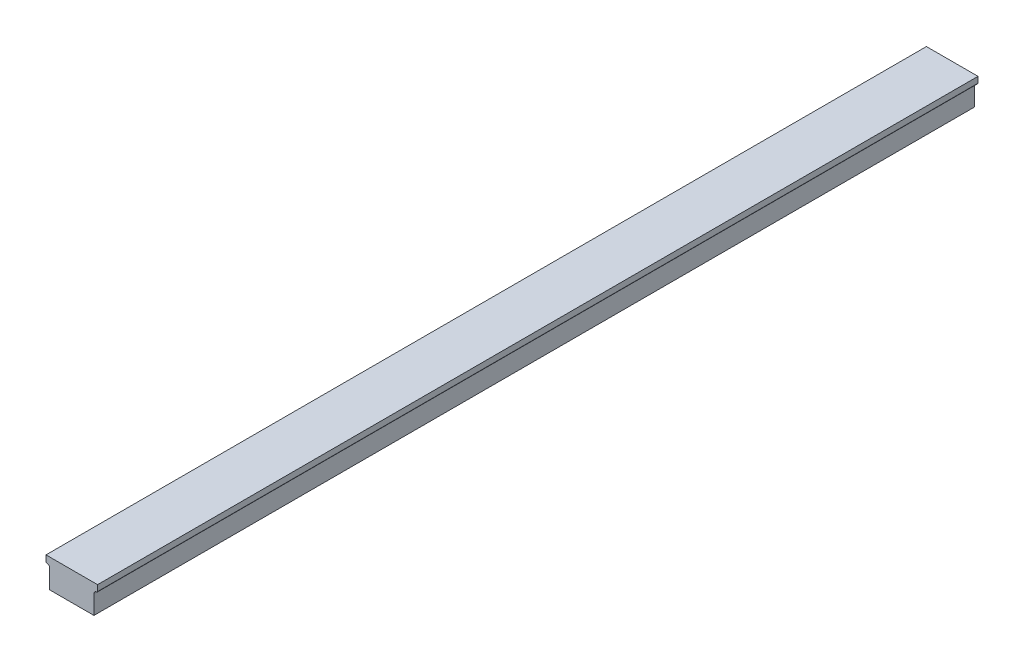
ISO-10303-21;
HEADER;
FILE_DESCRIPTION(('STEP AP214'),'2;1');
FILE_NAME('part.step','',(''),(''),'','','');
FILE_SCHEMA(('AUTOMOTIVE_DESIGN { 1 0 10303 214 1 1 1 1 }'));
ENDSEC;
DATA;
#1=APPLICATION_CONTEXT('core data for automotive mechanical design processes');
#2=APPLICATION_PROTOCOL_DEFINITION('international standard','automotive_design',2000,#1);
#3=PRODUCT_CONTEXT('',#1,'mechanical');
#4=PRODUCT('Part','Part','',(#3));
#5=PRODUCT_RELATED_PRODUCT_CATEGORY('part','',(#4));
#6=PRODUCT_DEFINITION_FORMATION('','',#4);
#7=PRODUCT_DEFINITION_CONTEXT('part definition',#1,'design');
#8=PRODUCT_DEFINITION('design','',#6,#7);
#9=PRODUCT_DEFINITION_SHAPE('','',#8);
#10=(LENGTH_UNIT() NAMED_UNIT(*) SI_UNIT(.MILLI.,.METRE.));
#11=(NAMED_UNIT(*) PLANE_ANGLE_UNIT() SI_UNIT($,.RADIAN.));
#12=(NAMED_UNIT(*) SI_UNIT($,.STERADIAN.) SOLID_ANGLE_UNIT());
#13=UNCERTAINTY_MEASURE_WITH_UNIT(LENGTH_MEASURE(1.E-05),#10,'distance_accuracy_value','');
#14=(GEOMETRIC_REPRESENTATION_CONTEXT(3) GLOBAL_UNCERTAINTY_ASSIGNED_CONTEXT((#13)) GLOBAL_UNIT_ASSIGNED_CONTEXT((#10,
#11,#12)) REPRESENTATION_CONTEXT('',''));
#15=CARTESIAN_POINT('',(0.,0.,0.));
#16=DIRECTION('',(0.,0.,1.));
#17=DIRECTION('',(1.,0.,0.));
#18=AXIS2_PLACEMENT_3D('',#15,#16,#17);
#19=CARTESIAN_POINT('',(4.9,2.4,194.633333333333));
#20=DIRECTION('',(-1.,0.,0.));
#21=DIRECTION('',(0.,0.,1.));
#22=AXIS2_PLACEMENT_3D('',#19,#20,#21);
#23=PLANE('',#22);
#24=DIRECTION('',(0.,1.,0.));
#25=VECTOR('',#24,1.);
#26=CARTESIAN_POINT('',(4.9,2.4,0.));
#27=LINE('',#26,#25);
#28=CARTESIAN_POINT('',(4.9,-2.4,0.));
#29=VERTEX_POINT('',#28);
#30=CARTESIAN_POINT('',(4.9,1.8,0.));
#31=VERTEX_POINT('',#30);
#32=EDGE_CURVE('E147',#29,#31,#27,.T.);
#33=ORIENTED_EDGE('',*,*,#32,.T.);
#34=DIRECTION('',(0.,0.,-1.));
#35=VECTOR('',#34,1.);
#36=CARTESIAN_POINT('',(4.9,1.8,194.633333333333));
#37=LINE('',#36,#35);
#38=CARTESIAN_POINT('',(4.9,1.8,194.633333333333));
#39=VERTEX_POINT('',#38);
#40=EDGE_CURVE('E167',#31,#39,#37,.F.);
#41=ORIENTED_EDGE('',*,*,#40,.T.);
#42=DIRECTION('',(0.,1.,0.));
#43=VECTOR('',#42,1.);
#44=CARTESIAN_POINT('',(4.9,2.4,194.633333333333));
#45=LINE('',#44,#43);
#46=CARTESIAN_POINT('',(4.9,-2.4,194.633333333333));
#47=VERTEX_POINT('',#46);
#48=EDGE_CURVE('E123',#47,#39,#45,.T.);
#49=ORIENTED_EDGE('',*,*,#48,.F.);
#50=DIRECTION('',(0.,0.,-1.));
#51=VECTOR('',#50,1.);
#52=CARTESIAN_POINT('',(4.9,-2.4,194.633333333333));
#53=LINE('',#52,#51);
#54=EDGE_CURVE('E146',#47,#29,#53,.T.);
#55=ORIENTED_EDGE('',*,*,#54,.T.);
#56=EDGE_LOOP('',(#33,#41,#49,#55));
#57=FACE_BOUND('',#56,.T.);
#58=ADVANCED_FACE('F39',(#57),#23,.F.);
#59=CARTESIAN_POINT('',(5.7,3.9,194.633333333333));
#60=DIRECTION('',(-1.,0.,0.));
#61=DIRECTION('',(0.,0.,1.));
#62=AXIS2_PLACEMENT_3D('',#59,#60,#61);
#63=PLANE('',#62);
#64=DIRECTION('',(0.,1.,0.));
#65=VECTOR('',#64,1.);
#66=CARTESIAN_POINT('',(5.7,3.9,194.633333333333));
#67=LINE('',#66,#65);
#68=CARTESIAN_POINT('',(5.7,2.6,194.633333333333));
#69=VERTEX_POINT('',#68);
#70=CARTESIAN_POINT('',(5.7,3.9,194.633333333333));
#71=VERTEX_POINT('',#70);
#72=EDGE_CURVE('E115',#69,#71,#67,.T.);
#73=ORIENTED_EDGE('',*,*,#72,.F.);
#74=DIRECTION('',(0.,0.,-1.));
#75=VECTOR('',#74,1.);
#76=CARTESIAN_POINT('',(5.7,2.6,194.633333333333));
#77=LINE('',#76,#75);
#78=CARTESIAN_POINT('',(5.7,2.6,0.));
#79=VERTEX_POINT('',#78);
#80=EDGE_CURVE('E11',#69,#79,#77,.T.);
#81=ORIENTED_EDGE('',*,*,#80,.T.);
#82=DIRECTION('',(0.,1.,0.));
#83=VECTOR('',#82,1.);
#84=CARTESIAN_POINT('',(5.7,3.9,0.));
#85=LINE('',#84,#83);
#86=CARTESIAN_POINT('',(5.7,3.9,0.));
#87=VERTEX_POINT('',#86);
#88=EDGE_CURVE('E129',#79,#87,#85,.T.);
#89=ORIENTED_EDGE('',*,*,#88,.T.);
#90=DIRECTION('',(0.,0.,-1.));
#91=VECTOR('',#90,1.);
#92=CARTESIAN_POINT('',(5.7,3.9,194.633333333333));
#93=LINE('',#92,#91);
#94=EDGE_CURVE('E126',#71,#87,#93,.T.);
#95=ORIENTED_EDGE('',*,*,#94,.F.);
#96=EDGE_LOOP('',(#73,#81,#89,#95));
#97=FACE_BOUND('',#96,.T.);
#98=ADVANCED_FACE('F127',(#97),#63,.F.);
#99=CARTESIAN_POINT('',(-5.7,3.9,194.633333333333));
#100=DIRECTION('',(0.,-1.,0.));
#101=DIRECTION('',(0.,0.,-1.));
#102=AXIS2_PLACEMENT_3D('',#99,#100,#101);
#103=PLANE('',#102);
#104=DIRECTION('',(-1.,0.,0.));
#105=VECTOR('',#104,1.);
#106=CARTESIAN_POINT('',(-5.7,3.9,0.));
#107=LINE('',#106,#105);
#108=CARTESIAN_POINT('',(-5.7,3.9,0.));
#109=VERTEX_POINT('',#108);
#110=EDGE_CURVE('E151',#87,#109,#107,.T.);
#111=ORIENTED_EDGE('',*,*,#110,.T.);
#112=DIRECTION('',(0.,0.,-1.));
#113=VECTOR('',#112,1.);
#114=CARTESIAN_POINT('',(-5.7,3.9,194.633333333333));
#115=LINE('',#114,#113);
#116=CARTESIAN_POINT('',(-5.7,3.9,194.633333333333));
#117=VERTEX_POINT('',#116);
#118=EDGE_CURVE('E133',#117,#109,#115,.T.);
#119=ORIENTED_EDGE('',*,*,#118,.F.);
#120=DIRECTION('',(-1.,0.,0.));
#121=VECTOR('',#120,1.);
#122=CARTESIAN_POINT('',(-5.7,3.9,194.633333333333));
#123=LINE('',#122,#121);
#124=EDGE_CURVE('E119',#71,#117,#123,.T.);
#125=ORIENTED_EDGE('',*,*,#124,.F.);
#126=ORIENTED_EDGE('',*,*,#94,.T.);
#127=EDGE_LOOP('',(#111,#119,#125,#126));
#128=FACE_BOUND('',#127,.T.);
#129=ADVANCED_FACE('F135',(#128),#103,.F.);
#130=CARTESIAN_POINT('',(-5.7,3.9,194.633333333333));
#131=DIRECTION('',(1.,0.,0.));
#132=DIRECTION('',(0.,0.,-1.));
#133=AXIS2_PLACEMENT_3D('',#130,#131,#132);
#134=PLANE('',#133);
#135=DIRECTION('',(0.,-1.,0.));
#136=VECTOR('',#135,1.);
#137=CARTESIAN_POINT('',(-5.7,3.9,0.));
#138=LINE('',#137,#136);
#139=CARTESIAN_POINT('',(-5.7,2.6,0.));
#140=VERTEX_POINT('',#139);
#141=EDGE_CURVE('E153',#109,#140,#138,.T.);
#142=ORIENTED_EDGE('',*,*,#141,.T.);
#143=DIRECTION('',(0.,0.,-1.));
#144=VECTOR('',#143,1.);
#145=CARTESIAN_POINT('',(-5.7,2.6,194.633333333333));
#146=LINE('',#145,#144);
#147=CARTESIAN_POINT('',(-5.7,2.6,194.633333333333));
#148=VERTEX_POINT('',#147);
#149=EDGE_CURVE('E62',#140,#148,#146,.F.);
#150=ORIENTED_EDGE('',*,*,#149,.T.);
#151=DIRECTION('',(0.,-1.,0.));
#152=VECTOR('',#151,1.);
#153=CARTESIAN_POINT('',(-5.7,3.9,194.633333333333));
#154=LINE('',#153,#152);
#155=EDGE_CURVE('E137',#117,#148,#154,.T.);
#156=ORIENTED_EDGE('',*,*,#155,.F.);
#157=ORIENTED_EDGE('',*,*,#118,.T.);
#158=EDGE_LOOP('',(#142,#150,#156,#157));
#159=FACE_BOUND('',#158,.T.);
#160=ADVANCED_FACE('F221',(#159),#134,.F.);
#161=CARTESIAN_POINT('',(-4.9,2.4,194.633333333333));
#162=DIRECTION('',(1.,0.,0.));
#163=DIRECTION('',(0.,0.,-1.));
#164=AXIS2_PLACEMENT_3D('',#161,#162,#163);
#165=PLANE('',#164);
#166=DIRECTION('',(0.,-1.,0.));
#167=VECTOR('',#166,1.);
#168=CARTESIAN_POINT('',(-4.9,2.4,194.633333333333));
#169=LINE('',#168,#167);
#170=CARTESIAN_POINT('',(-4.9,1.8,194.633333333333));
#171=VERTEX_POINT('',#170);
#172=CARTESIAN_POINT('',(-4.9,-2.4,194.633333333333));
#173=VERTEX_POINT('',#172);
#174=EDGE_CURVE('E139',#171,#173,#169,.T.);
#175=ORIENTED_EDGE('',*,*,#174,.F.);
#176=DIRECTION('',(0.,0.,-1.));
#177=VECTOR('',#176,1.);
#178=CARTESIAN_POINT('',(-4.9,1.8,0.));
#179=LINE('',#178,#177);
#180=CARTESIAN_POINT('',(-4.9,1.8,0.));
#181=VERTEX_POINT('',#180);
#182=EDGE_CURVE('E169',#171,#181,#179,.T.);
#183=ORIENTED_EDGE('',*,*,#182,.T.);
#184=DIRECTION('',(0.,-1.,0.));
#185=VECTOR('',#184,1.);
#186=CARTESIAN_POINT('',(-4.9,2.4,0.));
#187=LINE('',#186,#185);
#188=CARTESIAN_POINT('',(-4.9,-2.4,0.));
#189=VERTEX_POINT('',#188);
#190=EDGE_CURVE('E155',#181,#189,#187,.T.);
#191=ORIENTED_EDGE('',*,*,#190,.T.);
#192=DIRECTION('',(0.,0.,-1.));
#193=VECTOR('',#192,1.);
#194=CARTESIAN_POINT('',(-4.9,-2.4,194.633333333333));
#195=LINE('',#194,#193);
#196=EDGE_CURVE('E161',#173,#189,#195,.T.);
#197=ORIENTED_EDGE('',*,*,#196,.F.);
#198=EDGE_LOOP('',(#175,#183,#191,#197));
#199=FACE_BOUND('',#198,.T.);
#200=ADVANCED_FACE('F204',(#199),#165,.F.);
#201=CARTESIAN_POINT('',(-4.9,-2.4,194.633333333333));
#202=DIRECTION('',(0.,1.,0.));
#203=DIRECTION('',(0.,0.,1.));
#204=AXIS2_PLACEMENT_3D('',#201,#202,#203);
#205=PLANE('',#204);
#206=DIRECTION('',(1.,0.,0.));
#207=VECTOR('',#206,1.);
#208=CARTESIAN_POINT('',(-4.9,-2.4,0.));
#209=LINE('',#208,#207);
#210=EDGE_CURVE('E157',#189,#29,#209,.T.);
#211=ORIENTED_EDGE('',*,*,#210,.T.);
#212=ORIENTED_EDGE('',*,*,#54,.F.);
#213=DIRECTION('',(1.,0.,0.));
#214=VECTOR('',#213,1.);
#215=CARTESIAN_POINT('',(-4.9,-2.4,194.633333333333));
#216=LINE('',#215,#214);
#217=EDGE_CURVE('E144',#173,#47,#216,.T.);
#218=ORIENTED_EDGE('',*,*,#217,.F.);
#219=ORIENTED_EDGE('',*,*,#196,.T.);
#220=EDGE_LOOP('',(#211,#212,#218,#219));
#221=FACE_BOUND('',#220,.T.);
#222=ADVANCED_FACE('F212',(#221),#205,.F.);
#223=CARTESIAN_POINT('',(0.,0.,194.633333333333));
#224=DIRECTION('',(0.,0.,1.));
#225=DIRECTION('',(1.,0.,0.));
#226=AXIS2_PLACEMENT_3D('',#223,#224,#225);
#227=PLANE('',#226);
#228=ORIENTED_EDGE('',*,*,#155,.T.);
#229=CARTESIAN_POINT('',(-5.5,2.6,194.633333333333));
#230=DIRECTION('',(0.,0.,1.));
#231=DIRECTION('',(1.,0.,0.));
#232=AXIS2_PLACEMENT_3D('',#229,#230,#231);
#233=CIRCLE('',#232,0.2);
#234=CARTESIAN_POINT('',(-5.5,2.4,194.633333333333));
#235=VERTEX_POINT('',#234);
#236=EDGE_CURVE('E47',#148,#235,#233,.T.);
#237=ORIENTED_EDGE('',*,*,#236,.T.);
#238=CARTESIAN_POINT('',(-5.5,1.8,194.633333333333));
#239=DIRECTION('',(0.,0.,1.));
#240=DIRECTION('',(1.,0.,0.));
#241=AXIS2_PLACEMENT_3D('',#238,#239,#240);
#242=CIRCLE('',#241,0.6);
#243=EDGE_CURVE('E182',#235,#171,#242,.F.);
#244=ORIENTED_EDGE('',*,*,#243,.T.);
#245=ORIENTED_EDGE('',*,*,#174,.T.);
#246=ORIENTED_EDGE('',*,*,#217,.T.);
#247=ORIENTED_EDGE('',*,*,#48,.T.);
#248=CARTESIAN_POINT('',(5.5,1.8,194.633333333333));
#249=DIRECTION('',(0.,0.,1.));
#250=DIRECTION('',(1.,0.,0.));
#251=AXIS2_PLACEMENT_3D('',#248,#249,#250);
#252=CIRCLE('',#251,0.6);
#253=CARTESIAN_POINT('',(5.5,2.4,194.633333333333));
#254=VERTEX_POINT('',#253);
#255=EDGE_CURVE('E177',#39,#254,#252,.F.);
#256=ORIENTED_EDGE('',*,*,#255,.T.);
#257=CARTESIAN_POINT('',(5.5,2.6,194.633333333333));
#258=DIRECTION('',(0.,0.,1.));
#259=DIRECTION('',(1.,0.,0.));
#260=AXIS2_PLACEMENT_3D('',#257,#258,#259);
#261=CIRCLE('',#260,0.2);
#262=EDGE_CURVE('E54',#254,#69,#261,.T.);
#263=ORIENTED_EDGE('',*,*,#262,.T.);
#264=ORIENTED_EDGE('',*,*,#72,.T.);
#265=ORIENTED_EDGE('',*,*,#124,.T.);
#266=EDGE_LOOP('',(#228,#237,#244,#245,#246,#247,#256,#263,#264,#265));
#267=FACE_BOUND('',#266,.T.);
#268=ADVANCED_FACE('F117',(#267),#227,.T.);
#269=CARTESIAN_POINT('',(0.,0.,0.));
#270=DIRECTION('',(0.,0.,1.));
#271=DIRECTION('',(1.,0.,0.));
#272=AXIS2_PLACEMENT_3D('',#269,#270,#271);
#273=PLANE('',#272);
#274=CARTESIAN_POINT('',(-5.5,1.8,0.));
#275=DIRECTION('',(0.,0.,1.));
#276=DIRECTION('',(1.,0.,0.));
#277=AXIS2_PLACEMENT_3D('',#274,#275,#276);
#278=CIRCLE('',#277,0.6);
#279=CARTESIAN_POINT('',(-5.5,2.4,0.));
#280=VERTEX_POINT('',#279);
#281=EDGE_CURVE('E179',#181,#280,#278,.T.);
#282=ORIENTED_EDGE('',*,*,#281,.T.);
#283=CARTESIAN_POINT('',(-5.5,2.6,0.));
#284=DIRECTION('',(0.,0.,1.));
#285=DIRECTION('',(1.,0.,0.));
#286=AXIS2_PLACEMENT_3D('',#283,#284,#285);
#287=CIRCLE('',#286,0.2);
#288=EDGE_CURVE('E186',#280,#140,#287,.F.);
#289=ORIENTED_EDGE('',*,*,#288,.T.);
#290=ORIENTED_EDGE('',*,*,#141,.F.);
#291=ORIENTED_EDGE('',*,*,#110,.F.);
#292=ORIENTED_EDGE('',*,*,#88,.F.);
#293=CARTESIAN_POINT('',(5.5,2.6,0.));
#294=DIRECTION('',(0.,0.,1.));
#295=DIRECTION('',(1.,0.,0.));
#296=AXIS2_PLACEMENT_3D('',#293,#294,#295);
#297=CIRCLE('',#296,0.2);
#298=CARTESIAN_POINT('',(5.5,2.4,0.));
#299=VERTEX_POINT('',#298);
#300=EDGE_CURVE('E184',#79,#299,#297,.F.);
#301=ORIENTED_EDGE('',*,*,#300,.T.);
#302=CARTESIAN_POINT('',(5.5,1.8,0.));
#303=DIRECTION('',(0.,0.,1.));
#304=DIRECTION('',(1.,0.,0.));
#305=AXIS2_PLACEMENT_3D('',#302,#303,#304);
#306=CIRCLE('',#305,0.6);
#307=EDGE_CURVE('E175',#299,#31,#306,.T.);
#308=ORIENTED_EDGE('',*,*,#307,.T.);
#309=ORIENTED_EDGE('',*,*,#32,.F.);
#310=ORIENTED_EDGE('',*,*,#210,.F.);
#311=ORIENTED_EDGE('',*,*,#190,.F.);
#312=EDGE_LOOP('',(#282,#289,#290,#291,#292,#301,#308,#309,#310,#311));
#313=FACE_BOUND('',#312,.T.);
#314=ADVANCED_FACE('F201',(#313),#273,.F.);
#315=CARTESIAN_POINT('',(5.5,1.8,194.633333333333));
#316=DIRECTION('',(0.,0.,1.));
#317=DIRECTION('',(1.,0.,0.));
#318=AXIS2_PLACEMENT_3D('',#315,#316,#317);
#319=CYLINDRICAL_SURFACE('',#318,0.6);
#320=ORIENTED_EDGE('',*,*,#255,.F.);
#321=ORIENTED_EDGE('',*,*,#40,.F.);
#322=ORIENTED_EDGE('',*,*,#307,.F.);
#323=DIRECTION('',(0.,0.,-1.));
#324=VECTOR('',#323,1.);
#325=CARTESIAN_POINT('',(5.5,2.4,0.));
#326=LINE('',#325,#324);
#327=EDGE_CURVE('E132',#254,#299,#326,.T.);
#328=ORIENTED_EDGE('',*,*,#327,.F.);
#329=EDGE_LOOP('',(#320,#321,#322,#328));
#330=FACE_BOUND('',#329,.T.);
#331=ADVANCED_FACE('F218',(#330),#319,.F.);
#332=CARTESIAN_POINT('',(-5.5,1.8,194.633333333333));
#333=DIRECTION('',(0.,0.,1.));
#334=DIRECTION('',(1.,0.,0.));
#335=AXIS2_PLACEMENT_3D('',#332,#333,#334);
#336=CYLINDRICAL_SURFACE('',#335,0.6);
#337=ORIENTED_EDGE('',*,*,#243,.F.);
#338=DIRECTION('',(0.,0.,-1.));
#339=VECTOR('',#338,1.);
#340=CARTESIAN_POINT('',(-5.5,2.4,194.633333333333));
#341=LINE('',#340,#339);
#342=EDGE_CURVE('E172',#280,#235,#341,.F.);
#343=ORIENTED_EDGE('',*,*,#342,.F.);
#344=ORIENTED_EDGE('',*,*,#281,.F.);
#345=ORIENTED_EDGE('',*,*,#182,.F.);
#346=EDGE_LOOP('',(#337,#343,#344,#345));
#347=FACE_BOUND('',#346,.T.);
#348=ADVANCED_FACE('F196',(#347),#336,.F.);
#349=CARTESIAN_POINT('',(-5.5,2.6,194.633333333333));
#350=DIRECTION('',(0.,0.,-1.));
#351=DIRECTION('',(-1.,0.,0.));
#352=AXIS2_PLACEMENT_3D('',#349,#350,#351);
#353=CYLINDRICAL_SURFACE('',#352,0.2);
#354=ORIENTED_EDGE('',*,*,#236,.F.);
#355=ORIENTED_EDGE('',*,*,#149,.F.);
#356=ORIENTED_EDGE('',*,*,#288,.F.);
#357=ORIENTED_EDGE('',*,*,#342,.T.);
#358=EDGE_LOOP('',(#354,#355,#356,#357));
#359=FACE_BOUND('',#358,.T.);
#360=ADVANCED_FACE('F197',(#359),#353,.T.);
#361=CARTESIAN_POINT('',(5.5,2.6,194.633333333333));
#362=DIRECTION('',(0.,0.,-1.));
#363=DIRECTION('',(-1.,0.,0.));
#364=AXIS2_PLACEMENT_3D('',#361,#362,#363);
#365=CYLINDRICAL_SURFACE('',#364,0.2);
#366=ORIENTED_EDGE('',*,*,#262,.F.);
#367=ORIENTED_EDGE('',*,*,#327,.T.);
#368=ORIENTED_EDGE('',*,*,#300,.F.);
#369=ORIENTED_EDGE('',*,*,#80,.F.);
#370=EDGE_LOOP('',(#366,#367,#368,#369));
#371=FACE_BOUND('',#370,.T.);
#372=ADVANCED_FACE('F41',(#371),#365,.T.);
#373=CLOSED_SHELL('',(#58,#98,#129,#160,#200,#222,#268,#314,#331,#348,#360,#372));
#374=MANIFOLD_SOLID_BREP('B2',#373);
#375=ADVANCED_BREP_SHAPE_REPRESENTATION('',(#18,#374),#14);
#376=SHAPE_DEFINITION_REPRESENTATION(#9,#375);
ENDSEC;
END-ISO-10303-21;
